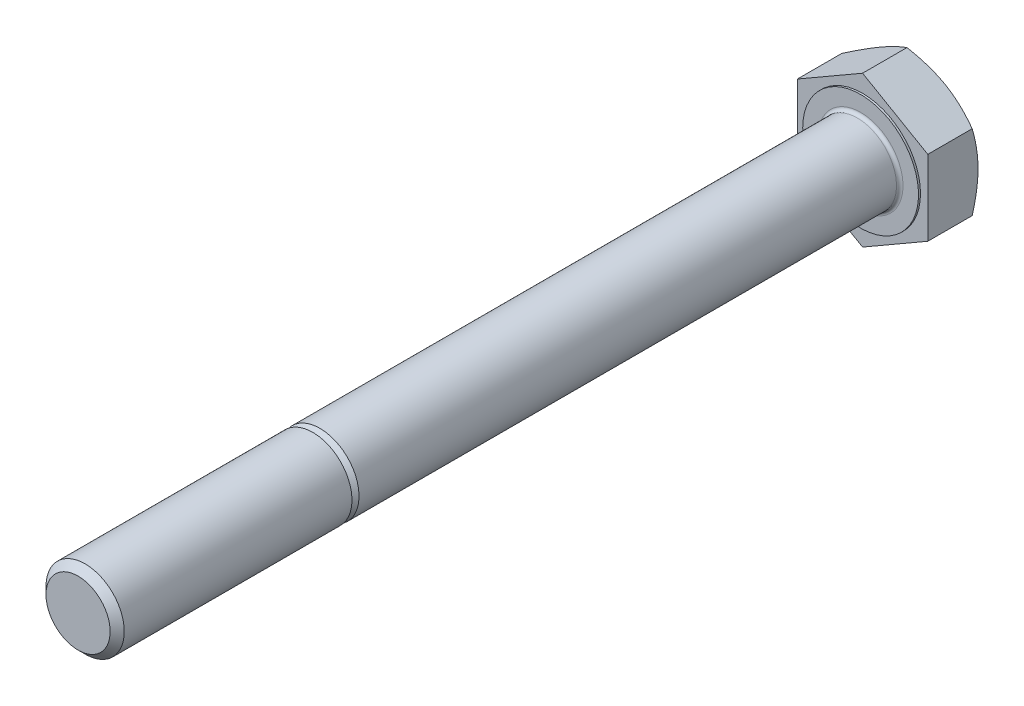
ISO-10303-21;
HEADER;
FILE_DESCRIPTION(('STEP AP214'),'2;1');
FILE_NAME('part.step','',(''),(''),'','','');
FILE_SCHEMA(('AUTOMOTIVE_DESIGN { 1 0 10303 214 1 1 1 1 }'));
ENDSEC;
DATA;
#1=APPLICATION_CONTEXT('core data for automotive mechanical design processes');
#2=APPLICATION_PROTOCOL_DEFINITION('international standard','automotive_design',2000,#1);
#3=PRODUCT_CONTEXT('',#1,'mechanical');
#4=PRODUCT('Part','Part','',(#3));
#5=PRODUCT_RELATED_PRODUCT_CATEGORY('part','',(#4));
#6=PRODUCT_DEFINITION_FORMATION('','',#4);
#7=PRODUCT_DEFINITION_CONTEXT('part definition',#1,'design');
#8=PRODUCT_DEFINITION('design','',#6,#7);
#9=PRODUCT_DEFINITION_SHAPE('','',#8);
#10=(LENGTH_UNIT() NAMED_UNIT(*) SI_UNIT(.MILLI.,.METRE.));
#11=(NAMED_UNIT(*) PLANE_ANGLE_UNIT() SI_UNIT($,.RADIAN.));
#12=(NAMED_UNIT(*) SI_UNIT($,.STERADIAN.) SOLID_ANGLE_UNIT());
#13=UNCERTAINTY_MEASURE_WITH_UNIT(LENGTH_MEASURE(1.E-05),#10,'distance_accuracy_value','');
#14=(GEOMETRIC_REPRESENTATION_CONTEXT(3) GLOBAL_UNCERTAINTY_ASSIGNED_CONTEXT((#13)) GLOBAL_UNIT_ASSIGNED_CONTEXT((#10,
#11,#12)) REPRESENTATION_CONTEXT('',''));
#15=CARTESIAN_POINT('',(0.,0.,0.));
#16=DIRECTION('',(0.,0.,1.));
#17=DIRECTION('',(1.,0.,0.));
#18=AXIS2_PLACEMENT_3D('',#15,#16,#17);
#19=CARTESIAN_POINT('',(0.,0.,60.));
#20=DIRECTION('',(0.,0.,-1.));
#21=DIRECTION('',(-1.,0.,0.));
#22=AXIS2_PLACEMENT_3D('',#19,#20,#21);
#23=PLANE('',#22);
#24=CARTESIAN_POINT('',(0.,0.,60.));
#25=DIRECTION('',(0.,0.,-1.));
#26=DIRECTION('',(-1.,0.,0.));
#27=AXIS2_PLACEMENT_3D('',#24,#25,#26);
#28=CIRCLE('',#27,2.45875);
#29=CARTESIAN_POINT('',(-2.45875,0.,60.));
#30=VERTEX_POINT('',#29);
#31=EDGE_CURVE('E9',#30,#30,#28,.T.);
#32=ORIENTED_EDGE('',*,*,#31,.F.);
#33=EDGE_LOOP('',(#32));
#34=FACE_BOUND('',#33,.T.);
#35=ADVANCED_FACE('F15',(#34),#23,.F.);
#36=CARTESIAN_POINT('',(0.,0.,60.));
#37=DIRECTION('',(0.,0.,-1.));
#38=DIRECTION('',(-1.,0.,0.));
#39=AXIS2_PLACEMENT_3D('',#36,#37,#38);
#40=CONICAL_SURFACE('',#39,2.45875,0.785398163397449);
#41=CARTESIAN_POINT('',(0.,0.,59.45875));
#42=DIRECTION('',(0.,0.,-1.));
#43=DIRECTION('',(-1.,0.,0.));
#44=AXIS2_PLACEMENT_3D('',#41,#42,#43);
#45=CIRCLE('',#44,3.);
#46=CARTESIAN_POINT('',(-3.,0.,59.45875));
#47=VERTEX_POINT('',#46);
#48=EDGE_CURVE('E24',#47,#47,#45,.T.);
#49=ORIENTED_EDGE('',*,*,#48,.F.);
#50=EDGE_LOOP('',(#49));
#51=FACE_BOUND('',#50,.T.);
#52=ORIENTED_EDGE('',*,*,#31,.T.);
#53=EDGE_LOOP('',(#52));
#54=FACE_BOUND('',#53,.T.);
#55=ADVANCED_FACE('F211',(#51,#54),#40,.T.);
#56=CARTESIAN_POINT('',(0.,0.,-0.65));
#57=DIRECTION('',(0.,0.,-1.));
#58=DIRECTION('',(-1.,0.,0.));
#59=AXIS2_PLACEMENT_3D('',#56,#57,#58);
#60=CYLINDRICAL_SURFACE('',#59,3.);
#61=CARTESIAN_POINT('',(0.,0.,42.));
#62=DIRECTION('',(0.,0.,-1.));
#63=DIRECTION('',(-1.,0.,0.));
#64=AXIS2_PLACEMENT_3D('',#61,#62,#63);
#65=CIRCLE('',#64,3.);
#66=CARTESIAN_POINT('',(-3.,0.,42.));
#67=VERTEX_POINT('',#66);
#68=EDGE_CURVE('E226',#67,#67,#65,.T.);
#69=ORIENTED_EDGE('',*,*,#68,.F.);
#70=EDGE_LOOP('',(#69));
#71=FACE_BOUND('',#70,.T.);
#72=ORIENTED_EDGE('',*,*,#48,.T.);
#73=EDGE_LOOP('',(#72));
#74=FACE_BOUND('',#73,.T.);
#75=ADVANCED_FACE('F208',(#71,#74),#60,.T.);
#76=CARTESIAN_POINT('',(0.,3.,42.));
#77=DIRECTION('',(0.,0.,1.));
#78=DIRECTION('',(1.,0.,0.));
#79=AXIS2_PLACEMENT_3D('',#76,#77,#78);
#80=PLANE('',#79);
#81=CARTESIAN_POINT('',(0.,0.,42.));
#82=DIRECTION('',(0.,0.,-1.));
#83=DIRECTION('',(-1.,0.,0.));
#84=AXIS2_PLACEMENT_3D('',#81,#82,#83);
#85=CIRCLE('',#84,2.45875);
#86=CARTESIAN_POINT('',(-2.45875,0.,42.));
#87=VERTEX_POINT('',#86);
#88=EDGE_CURVE('E233',#87,#87,#85,.T.);
#89=ORIENTED_EDGE('',*,*,#88,.F.);
#90=EDGE_LOOP('',(#89));
#91=FACE_BOUND('',#90,.T.);
#92=ORIENTED_EDGE('',*,*,#68,.T.);
#93=EDGE_LOOP('',(#92));
#94=FACE_BOUND('',#93,.T.);
#95=ADVANCED_FACE('F204',(#91,#94),#80,.F.);
#96=CARTESIAN_POINT('',(0.,0.,42.));
#97=DIRECTION('',(0.,0.,-1.));
#98=DIRECTION('',(-1.,0.,0.));
#99=AXIS2_PLACEMENT_3D('',#96,#97,#98);
#100=CONICAL_SURFACE('',#99,2.45875,0.785398163397457);
#101=CARTESIAN_POINT('',(0.,0.,41.45875));
#102=DIRECTION('',(0.,0.,-1.));
#103=DIRECTION('',(-1.,0.,0.));
#104=AXIS2_PLACEMENT_3D('',#101,#102,#103);
#105=CIRCLE('',#104,3.);
#106=CARTESIAN_POINT('',(-3.,0.,41.45875));
#107=VERTEX_POINT('',#106);
#108=EDGE_CURVE('E239',#107,#107,#105,.T.);
#109=ORIENTED_EDGE('',*,*,#108,.F.);
#110=EDGE_LOOP('',(#109));
#111=FACE_BOUND('',#110,.T.);
#112=ORIENTED_EDGE('',*,*,#88,.T.);
#113=EDGE_LOOP('',(#112));
#114=FACE_BOUND('',#113,.T.);
#115=ADVANCED_FACE('F200',(#111,#114),#100,.T.);
#116=CARTESIAN_POINT('',(0.,0.,-0.65));
#117=DIRECTION('',(0.,0.,-1.));
#118=DIRECTION('',(-1.,0.,0.));
#119=AXIS2_PLACEMENT_3D('',#116,#117,#118);
#120=CYLINDRICAL_SURFACE('',#119,3.);
#121=CARTESIAN_POINT('',(0.,0.,0.25));
#122=DIRECTION('',(0.,0.,-1.));
#123=DIRECTION('',(-1.,0.,0.));
#124=AXIS2_PLACEMENT_3D('',#121,#122,#123);
#125=CIRCLE('',#124,3.);
#126=CARTESIAN_POINT('',(-3.,0.,0.25));
#127=VERTEX_POINT('',#126);
#128=EDGE_CURVE('E243',#127,#127,#125,.T.);
#129=ORIENTED_EDGE('',*,*,#128,.F.);
#130=EDGE_LOOP('',(#129));
#131=FACE_BOUND('',#130,.T.);
#132=ORIENTED_EDGE('',*,*,#108,.T.);
#133=EDGE_LOOP('',(#132));
#134=FACE_BOUND('',#133,.T.);
#135=ADVANCED_FACE('F196',(#131,#134),#120,.T.);
#136=CARTESIAN_POINT('',(0.,0.,0.25));
#137=DIRECTION('',(0.,0.,-1.));
#138=DIRECTION('',(-1.,0.,0.));
#139=AXIS2_PLACEMENT_3D('',#136,#137,#138);
#140=TOROIDAL_SURFACE('',#139,3.25,0.25);
#141=ORIENTED_EDGE('',*,*,#128,.T.);
#142=EDGE_LOOP('',(#141));
#143=FACE_BOUND('',#142,.T.);
#144=CARTESIAN_POINT('',(0.,0.,0.));
#145=DIRECTION('',(0.,0.,-1.));
#146=DIRECTION('',(-1.,0.,0.));
#147=AXIS2_PLACEMENT_3D('',#144,#145,#146);
#148=CIRCLE('',#147,3.25);
#149=CARTESIAN_POINT('',(-3.25,0.,0.));
#150=VERTEX_POINT('',#149);
#151=EDGE_CURVE('E247',#150,#150,#148,.T.);
#152=ORIENTED_EDGE('',*,*,#151,.F.);
#153=EDGE_LOOP('',(#152));
#154=FACE_BOUND('',#153,.T.);
#155=ADVANCED_FACE('F192',(#143,#154),#140,.F.);
#156=CARTESIAN_POINT('',(0.,3.25,0.));
#157=DIRECTION('',(0.,0.,-1.));
#158=DIRECTION('',(-1.,0.,0.));
#159=AXIS2_PLACEMENT_3D('',#156,#157,#158);
#160=PLANE('',#159);
#161=CARTESIAN_POINT('',(0.,0.,0.));
#162=DIRECTION('',(0.,0.,-1.));
#163=DIRECTION('',(-1.,0.,0.));
#164=AXIS2_PLACEMENT_3D('',#161,#162,#163);
#165=CIRCLE('',#164,4.44);
#166=CARTESIAN_POINT('',(-4.44,0.,0.));
#167=VERTEX_POINT('',#166);
#168=EDGE_CURVE('E250',#167,#167,#165,.T.);
#169=ORIENTED_EDGE('',*,*,#168,.F.);
#170=EDGE_LOOP('',(#169));
#171=FACE_BOUND('',#170,.T.);
#172=ORIENTED_EDGE('',*,*,#151,.T.);
#173=EDGE_LOOP('',(#172));
#174=FACE_BOUND('',#173,.T.);
#175=ADVANCED_FACE('F188',(#171,#174),#160,.F.);
#176=CARTESIAN_POINT('',(0.,0.,-0.65));
#177=DIRECTION('',(0.,0.,-1.));
#178=DIRECTION('',(-1.,0.,0.));
#179=AXIS2_PLACEMENT_3D('',#176,#177,#178);
#180=CYLINDRICAL_SURFACE('',#179,4.44);
#181=CARTESIAN_POINT('',(0.,0.,-0.15));
#182=DIRECTION('',(0.,0.,1.));
#183=DIRECTION('',(1.,0.,0.));
#184=AXIS2_PLACEMENT_3D('',#181,#182,#183);
#185=CIRCLE('',#184,4.44);
#186=CARTESIAN_POINT('',(4.44,0.,-0.15));
#187=VERTEX_POINT('',#186);
#188=EDGE_CURVE('E18',#187,#187,#185,.T.);
#189=ORIENTED_EDGE('',*,*,#188,.T.);
#190=EDGE_LOOP('',(#189));
#191=FACE_BOUND('',#190,.T.);
#192=ORIENTED_EDGE('',*,*,#168,.T.);
#193=EDGE_LOOP('',(#192));
#194=FACE_BOUND('',#193,.T.);
#195=ADVANCED_FACE('F185',(#191,#194),#180,.T.);
#196=CARTESIAN_POINT('',(0.,0.,-0.15));
#197=DIRECTION('',(0.,0.,1.));
#198=DIRECTION('',(-1.,0.,0.));
#199=AXIS2_PLACEMENT_3D('',#196,#197,#198);
#200=PLANE('',#199);
#201=DIRECTION('',(0.866025403784439,-0.5,0.));
#202=VECTOR('',#201,1.);
#203=CARTESIAN_POINT('',(0.,-5.77350269189626,-0.15));
#204=LINE('',#203,#202);
#205=CARTESIAN_POINT('',(-5.,-2.88675134594813,-0.15));
#206=VERTEX_POINT('',#205);
#207=CARTESIAN_POINT('',(0.,-5.77350269189626,-0.15));
#208=VERTEX_POINT('',#207);
#209=EDGE_CURVE('E274',#206,#208,#204,.T.);
#210=ORIENTED_EDGE('',*,*,#209,.T.);
#211=DIRECTION('',(0.866025403784439,0.5,0.));
#212=VECTOR('',#211,1.);
#213=CARTESIAN_POINT('',(5.,-2.88675134594812,-0.15));
#214=LINE('',#213,#212);
#215=CARTESIAN_POINT('',(5.,-2.88675134594812,-0.15));
#216=VERTEX_POINT('',#215);
#217=EDGE_CURVE('E99',#208,#216,#214,.T.);
#218=ORIENTED_EDGE('',*,*,#217,.T.);
#219=DIRECTION('',(0.,1.,0.));
#220=VECTOR('',#219,1.);
#221=CARTESIAN_POINT('',(5.,2.88675134594813,-0.15));
#222=LINE('',#221,#220);
#223=CARTESIAN_POINT('',(5.,2.88675134594813,-0.15));
#224=VERTEX_POINT('',#223);
#225=EDGE_CURVE('E95',#216,#224,#222,.T.);
#226=ORIENTED_EDGE('',*,*,#225,.T.);
#227=DIRECTION('',(-0.866025403784439,0.5,0.));
#228=VECTOR('',#227,1.);
#229=CARTESIAN_POINT('',(0.,5.77350269189626,-0.15));
#230=LINE('',#229,#228);
#231=CARTESIAN_POINT('',(0.,5.77350269189626,-0.15));
#232=VERTEX_POINT('',#231);
#233=EDGE_CURVE('E107',#224,#232,#230,.T.);
#234=ORIENTED_EDGE('',*,*,#233,.T.);
#235=DIRECTION('',(-0.866025403784439,-0.5,0.));
#236=VECTOR('',#235,1.);
#237=CARTESIAN_POINT('',(-5.,2.88675134594813,-0.15));
#238=LINE('',#237,#236);
#239=CARTESIAN_POINT('',(-5.,2.88675134594813,-0.15));
#240=VERTEX_POINT('',#239);
#241=EDGE_CURVE('E299',#232,#240,#238,.T.);
#242=ORIENTED_EDGE('',*,*,#241,.T.);
#243=DIRECTION('',(0.,-1.,0.));
#244=VECTOR('',#243,1.);
#245=CARTESIAN_POINT('',(-5.,-2.88675134594813,-0.15));
#246=LINE('',#245,#244);
#247=EDGE_CURVE('E278',#240,#206,#246,.T.);
#248=ORIENTED_EDGE('',*,*,#247,.T.);
#249=EDGE_LOOP('',(#210,#218,#226,#234,#242,#248));
#250=FACE_BOUND('',#249,.T.);
#251=ORIENTED_EDGE('',*,*,#188,.F.);
#252=EDGE_LOOP('',(#251));
#253=FACE_BOUND('',#252,.T.);
#254=ADVANCED_FACE('F140',(#250,#253),#200,.T.);
#255=CARTESIAN_POINT('',(0.,0.,-3.55255354137804));
#256=DIRECTION('',(0.,0.,1.));
#257=DIRECTION('',(-1.,0.,0.));
#258=AXIS2_PLACEMENT_3D('',#255,#256,#257);
#259=CONICAL_SURFACE('',#258,5.775,1.0471975511966);
#260=CARTESIAN_POINT('',(0.,0.,-4.));
#261=DIRECTION('',(0.,0.,1.));
#262=DIRECTION('',(-1.,0.,0.));
#263=AXIS2_PLACEMENT_3D('',#260,#261,#262);
#264=CIRCLE('',#263,5.);
#265=CARTESIAN_POINT('',(-2.5,-4.3301270189222,-4.));
#266=VERTEX_POINT('',#265);
#267=CARTESIAN_POINT('',(2.5,-4.33012701892219,-4.));
#268=VERTEX_POINT('',#267);
#269=EDGE_CURVE('E320',#266,#268,#264,.T.);
#270=ORIENTED_EDGE('',*,*,#269,.T.);
#271=CARTESIAN_POINT('',(5.000002,-2.88675019124759,-3.55341734594793));
#272=CARTESIAN_POINT('',(4.78027074694607,-3.01361208934764,-3.62667401283849));
#273=CARTESIAN_POINT('',(4.5586601198803,-3.14155904453935,-3.69330350087609));
#274=CARTESIAN_POINT('',(4.11160176522467,-3.39966830594325,-3.80960388176341));
#275=CARTESIAN_POINT('',(3.88614609670003,-3.52983519685628,-3.859233638035));
#276=CARTESIAN_POINT('',(3.43799439633442,-3.78857570170015,-3.93647343389728));
#277=CARTESIAN_POINT('',(3.21536814331772,-3.91710902880802,-3.96459799992946));
#278=CARTESIAN_POINT('',(2.8806459561398,-4.11036097367893,-3.98981464288414));
#279=CARTESIAN_POINT('',(2.76899557601673,-4.17482235069811,-3.99539321968897));
#280=CARTESIAN_POINT('',(2.54559174139457,-4.30380461475521,-4.00079886451652));
#281=CARTESIAN_POINT('',(2.43383829018766,-4.36832549989239,-4.00062611028573));
#282=CARTESIAN_POINT('',(2.12769088590962,-4.54507978616402,-3.99223835401767));
#283=CARTESIAN_POINT('',(1.93339845483021,-4.65725457354923,-3.97816111429647));
#284=CARTESIAN_POINT('',(1.54610304420474,-4.88085968312974,-3.93352860367383));
#285=CARTESIAN_POINT('',(1.35310142524446,-4.9922892197905,-3.90295808665975));
#286=CARTESIAN_POINT('',(0.965026180739004,-5.21634456667155,-3.826542206783));
#287=CARTESIAN_POINT('',(0.770001514907567,-5.32894210998795,-3.78037315312653));
#288=CARTESIAN_POINT('',(0.382860131316657,-5.55245829201861,-3.67558875648398));
#289=CARTESIAN_POINT('',(0.190738457644298,-5.66337979203051,-3.61699801824105));
#290=CARTESIAN_POINT('',(-1.9999999993508E-06,-5.7735038465968,-3.55341734594793));
#291=B_SPLINE_CURVE_WITH_KNOTS('',3,(#271,#272,#273,#274,#275,#276,#277,#278,#279,#280,#281,
#282,#283,#284,#285,#286,#287,#288,#289,#290),.UNSPECIFIED.,.F.,.F.,(4,2,2,2,2,2,2,2,2,4),(0.,
0.792540187012439,1.58698486313849,2.36176947896395,2.74878786986339,3.13579429986343,
3.80946255620209,4.48375460996337,5.17299926182492,5.86089121185928),.UNSPECIFIED.);
#292=CARTESIAN_POINT('',(0.,-5.77350269189626,-3.5534180126148));
#293=VERTEX_POINT('',#292);
#294=EDGE_CURVE('E31',#268,#293,#291,.T.);
#295=ORIENTED_EDGE('',*,*,#294,.T.);
#296=CARTESIAN_POINT('',(2.00000000064743E-06,-5.7735038465968,-3.55341734594793));
#297=CARTESIAN_POINT('',(-0.219729253053924,-5.64664194849674,-3.62667401283849));
#298=CARTESIAN_POINT('',(-0.441339880119702,-5.51869499330503,-3.69330350087609));
#299=CARTESIAN_POINT('',(-0.888398234775334,-5.26058573190113,-3.80960388176341));
#300=CARTESIAN_POINT('',(-1.11385390329997,-5.13041884098811,-3.85923363803499));
#301=CARTESIAN_POINT('',(-1.56200560366558,-4.87167833614423,-3.93647343389728));
#302=CARTESIAN_POINT('',(-1.78463185668228,-4.74314500903636,-3.96459799992946));
#303=CARTESIAN_POINT('',(-2.1193540438602,-4.54989306416545,-3.98981464288413));
#304=CARTESIAN_POINT('',(-2.23100442398327,-4.48543168714627,-3.99539321968897));
#305=CARTESIAN_POINT('',(-2.45440825860543,-4.35644942308917,-4.00079886451652));
#306=CARTESIAN_POINT('',(-2.56616170981234,-4.291928537952,-4.00062611028572));
#307=CARTESIAN_POINT('',(-2.87230911409038,-4.11517425168036,-3.99223835401768));
#308=CARTESIAN_POINT('',(-3.06660154516979,-4.00299946429516,-3.97816111429647));
#309=CARTESIAN_POINT('',(-3.45389695579525,-3.77939435471464,-3.93352860367382));
#310=CARTESIAN_POINT('',(-3.64689857475554,-3.66796481805389,-3.90295808665975));
#311=CARTESIAN_POINT('',(-4.03497381926099,-3.44390947117283,-3.826542206783));
#312=CARTESIAN_POINT('',(-4.22999848509243,-3.33131192785644,-3.78037315312652));
#313=CARTESIAN_POINT('',(-4.61713986868334,-3.10779574582578,-3.67558875648398));
#314=CARTESIAN_POINT('',(-4.8092615423557,-2.99687424581388,-3.61699801824105));
#315=CARTESIAN_POINT('',(-5.000002,-2.88675019124759,-3.55341734594793));
#316=B_SPLINE_CURVE_WITH_KNOTS('',3,(#296,#297,#298,#299,#300,#301,#302,#303,#304,#305,#306,
#307,#308,#309,#310,#311,#312,#313,#314,#315),.UNSPECIFIED.,.F.,.F.,(4,2,2,2,2,2,2,2,2,4),(0.,
0.792540187012439,1.58698486313849,2.36176947896395,2.74878786986339,3.13579429986343,
3.80946255620209,4.48375460996337,5.17299926182492,5.86089121185927),.UNSPECIFIED.);
#317=EDGE_CURVE('E170',#293,#266,#316,.T.);
#318=ORIENTED_EDGE('',*,*,#317,.T.);
#319=EDGE_LOOP('',(#270,#295,#318));
#320=FACE_BOUND('',#319,.T.);
#321=ADVANCED_FACE('F138',(#320),#259,.T.);
#322=CARTESIAN_POINT('',(5.,0.,-4.));
#323=VERTEX_POINT('',#322);
#324=CARTESIAN_POINT('',(2.5,4.3301270189222,-4.));
#325=VERTEX_POINT('',#324);
#326=EDGE_CURVE('E337',#323,#325,#264,.T.);
#327=ORIENTED_EDGE('',*,*,#326,.T.);
#328=CARTESIAN_POINT('',(-2.00000000176389E-06,5.7735038465968,-3.55341734594793));
#329=CARTESIAN_POINT('',(0.219729253053923,5.64664194849674,-3.62667401283849));
#330=CARTESIAN_POINT('',(0.441339880119701,5.51869499330503,-3.69330350087608));
#331=CARTESIAN_POINT('',(0.888398234775333,5.26058573190113,-3.80960388176341));
#332=CARTESIAN_POINT('',(1.11385390329997,5.13041884098811,-3.85923363803499));
#333=CARTESIAN_POINT('',(1.56200560366558,4.87167833614423,-3.93647343389727));
#334=CARTESIAN_POINT('',(1.78463185668228,4.74314500903636,-3.96459799992946));
#335=CARTESIAN_POINT('',(2.1193540438602,4.54989306416545,-3.98981464288413));
#336=CARTESIAN_POINT('',(2.23100442398327,4.48543168714627,-3.99539321968896));
#337=CARTESIAN_POINT('',(2.45440825860543,4.35644942308917,-4.00079886451652));
#338=CARTESIAN_POINT('',(2.56616170981234,4.291928537952,-4.00062611028572));
#339=CARTESIAN_POINT('',(2.87230911409038,4.11517425168036,-3.99223835401768));
#340=CARTESIAN_POINT('',(3.06660154516979,4.00299946429516,-3.97816111429647));
#341=CARTESIAN_POINT('',(3.45389695579525,3.77939435471464,-3.93352860367382));
#342=CARTESIAN_POINT('',(3.64689857475554,3.66796481805389,-3.90295808665975));
#343=CARTESIAN_POINT('',(4.03497381926099,3.44390947117283,-3.826542206783));
#344=CARTESIAN_POINT('',(4.22999848509243,3.33131192785644,-3.78037315312652));
#345=CARTESIAN_POINT('',(4.61713986868334,3.10779574582578,-3.67558875648398));
#346=CARTESIAN_POINT('',(4.8092615423557,2.99687424581388,-3.61699801824105));
#347=CARTESIAN_POINT('',(5.000002,2.88675019124759,-3.55341734594793));
#348=B_SPLINE_CURVE_WITH_KNOTS('',3,(#328,#329,#330,#331,#332,#333,#334,#335,#336,#337,#338,
#339,#340,#341,#342,#343,#344,#345,#346,#347),.UNSPECIFIED.,.F.,.F.,(4,2,2,2,2,2,2,2,2,4),(0.,
0.792540187012439,1.58698486313849,2.36176947896395,2.74878786986339,3.13579429986343,
3.80946255620209,4.48375460996337,5.17299926182492,5.86089121185927),.UNSPECIFIED.);
#349=CARTESIAN_POINT('',(5.,2.88675134594813,-3.5534180126148));
#350=VERTEX_POINT('',#349);
#351=EDGE_CURVE('E146',#325,#350,#348,.T.);
#352=ORIENTED_EDGE('',*,*,#351,.T.);
#353=CARTESIAN_POINT('',(5.,7.6562098916072,-1.60730851220314));
#354=CARTESIAN_POINT('',(5.,7.43668068445188,-1.71339764971142));
#355=CARTESIAN_POINT('',(5.,7.21663244981121,-1.81843220971194));
#356=CARTESIAN_POINT('',(5.,6.77521729214901,-2.02578955660455));
#357=CARTESIAN_POINT('',(5.,6.55385014884433,-2.12811187401152));
#358=CARTESIAN_POINT('',(5.,6.10832079221155,-2.32998113103873));
#359=CARTESIAN_POINT('',(5.,5.8841498332562,-2.42950883856025));
#360=CARTESIAN_POINT('',(5.,5.43396545890423,-2.62428946678928));
#361=CARTESIAN_POINT('',(5.,5.20795214026935,-2.71954261031161));
#362=CARTESIAN_POINT('',(5.,4.75091730358844,-2.90576853562678));
#363=CARTESIAN_POINT('',(5.,4.51986836696229,-2.99667439468201));
#364=CARTESIAN_POINT('',(5.,4.05504511794166,-3.17136663535019));
#365=CARTESIAN_POINT('',(5.,3.82127050561655,-3.25515222488515));
#366=CARTESIAN_POINT('',(5.,3.3511049214154,-3.41335295122633));
#367=CARTESIAN_POINT('',(5.,3.1147207202618,-3.48778800852407));
#368=CARTESIAN_POINT('',(5.,2.63858935414024,-3.62486947210752));
#369=CARTESIAN_POINT('',(5.,2.39884327849118,-3.6875196062624));
#370=CARTESIAN_POINT('',(5.,1.91583600979795,-3.79799301517174));
#371=CARTESIAN_POINT('',(5.,1.67257390027251,-3.845812348464));
#372=CARTESIAN_POINT('',(5.,1.18308256945893,-3.92339260894802));
#373=CARTESIAN_POINT('',(5.,0.936853345569402,-3.95315352030607));
#374=CARTESIAN_POINT('',(5.,0.567117593289452,-3.98234325133118));
#375=CARTESIAN_POINT('',(5.,0.444189898759256,-3.98949936634909));
#376=CARTESIAN_POINT('',(5.,0.198136128994923,-3.99860265589306));
#377=CARTESIAN_POINT('',(5.,0.0750100563582902,-4.00054989807679));
#378=CARTESIAN_POINT('',(5.,-0.171177216207564,-3.99918313774808));
#379=CARTESIAN_POINT('',(5.,-0.294238424644018,-3.99587061329656));
#380=CARTESIAN_POINT('',(5.,-0.540114422491308,-3.98406827403109));
#381=CARTESIAN_POINT('',(5.,-0.662929199152966,-3.97557819794883));
#382=CARTESIAN_POINT('',(5.,-0.960602635172513,-3.94890221291608));
#383=CARTESIAN_POINT('',(5.,-1.13523252606317,-3.92812146624754));
#384=CARTESIAN_POINT('',(5.,-1.48312982453558,-3.87724859224778));
#385=CARTESIAN_POINT('',(5.,-1.65639704728773,-3.84715522336811));
#386=CARTESIAN_POINT('',(5.,-2.0014599099285,-3.77872143768562));
#387=CARTESIAN_POINT('',(5.,-2.17325390132186,-3.74037278751756));
#388=CARTESIAN_POINT('',(5.,-2.51508012917844,-3.65659803659306));
#389=CARTESIAN_POINT('',(5.,-2.68511247222647,-3.61117236671524));
#390=CARTESIAN_POINT('',(5.,-3.02759472997325,-3.51314465542335));
#391=CARTESIAN_POINT('',(5.,-3.20000183568428,-3.46039407843568));
#392=CARTESIAN_POINT('',(5.,-3.54299370259063,-3.34968060702553));
#393=CARTESIAN_POINT('',(5.,-3.71357963115188,-3.29172130765132));
#394=CARTESIAN_POINT('',(5.,-4.0522446464634,-3.17178761900049));
#395=CARTESIAN_POINT('',(5.00000000000001,-4.22033243885282,-3.10983766516145));
#396=CARTESIAN_POINT('',(5.00000000000001,-4.55520387372808,-2.98230148307792));
#397=CARTESIAN_POINT('',(5.,-4.72198695763952,-2.91671378527652));
#398=CARTESIAN_POINT('',(5.,-4.88816412582649,-2.84966706307693));
#399=B_SPLINE_CURVE_WITH_KNOTS('',3,(#353,#354,#355,#356,#357,#358,#359,#360,#361,#362,#363,
#364,#365,#366,#367,#368,#369,#370,#371,#372,#373,#374,#375,#376,#377,#378,#379,#380,#381,#382,
#383,#384,#385,#386,#387,#388,#389,#390,#391,#392,#393,#394,#395,#396,#397,#398),.UNSPECIFIED.,
.F.,.F.,(4,2,2,2,2,2,2,2,2,2,2,2,2,2,2,2,2,2,2,2,2,2,4),(0.,0.731468501053904,1.46306280212576,
2.19884351250473,2.93458582511369,3.67936259473395,4.42422210717282,5.16746683356836,
5.91047605604179,6.65368257320434,7.39688974201329,7.76620341787991,8.13551229673491,
8.5047174134909,8.87394116252395,9.40123334160666,9.92859584900567,10.456486776027,
10.9843455753877,11.5251349139371,12.0655538262241,12.6029309498223,13.1405267642076),.UNSPECIFIED.);
#400=EDGE_CURVE('E112',#350,#323,#399,.T.);
#401=ORIENTED_EDGE('',*,*,#400,.T.);
#402=EDGE_LOOP('',(#327,#352,#401));
#403=FACE_BOUND('',#402,.T.);
#404=ADVANCED_FACE('F139',(#403),#259,.T.);
#405=CARTESIAN_POINT('',(-2.5,4.3301270189222,-4.));
#406=VERTEX_POINT('',#405);
#407=EDGE_CURVE('E341',#325,#406,#264,.T.);
#408=ORIENTED_EDGE('',*,*,#407,.T.);
#409=CARTESIAN_POINT('',(-5.000002,2.88675019124759,-3.55341734594793));
#410=CARTESIAN_POINT('',(-4.78027074694607,3.01361208934765,-3.62667401283849));
#411=CARTESIAN_POINT('',(-4.5586601198803,3.14155904453936,-3.69330350087609));
#412=CARTESIAN_POINT('',(-4.11160176522467,3.39966830594326,-3.80960388176341));
#413=CARTESIAN_POINT('',(-3.88614609670003,3.52983519685628,-3.859233638035));
#414=CARTESIAN_POINT('',(-3.43799439633442,3.78857570170016,-3.93647343389728));
#415=CARTESIAN_POINT('',(-3.21536814331772,3.91710902880803,-3.96459799992946));
#416=CARTESIAN_POINT('',(-2.8806459561398,4.11036097367894,-3.98981464288413));
#417=CARTESIAN_POINT('',(-2.76899557601673,4.17482235069812,-3.99539321968897));
#418=CARTESIAN_POINT('',(-2.54559174139457,4.30380461475522,-4.00079886451652));
#419=CARTESIAN_POINT('',(-2.43383829018766,4.36832549989239,-4.00062611028572));
#420=CARTESIAN_POINT('',(-2.12769088590962,4.54507978616403,-3.99223835401768));
#421=CARTESIAN_POINT('',(-1.93339845483021,4.65725457354923,-3.97816111429647));
#422=CARTESIAN_POINT('',(-1.54610304420475,4.88085968312975,-3.93352860367382));
#423=CARTESIAN_POINT('',(-1.35310142524446,4.9922892197905,-3.90295808665975));
#424=CARTESIAN_POINT('',(-0.965026180739006,5.21634456667156,-3.826542206783));
#425=CARTESIAN_POINT('',(-0.77000151490757,5.32894210998795,-3.78037315312652));
#426=CARTESIAN_POINT('',(-0.38286013131666,5.55245829201861,-3.67558875648398));
#427=CARTESIAN_POINT('',(-0.190738457644301,5.66337979203051,-3.61699801824105));
#428=CARTESIAN_POINT('',(1.99999999749083E-06,5.7735038465968,-3.55341734594793));
#429=B_SPLINE_CURVE_WITH_KNOTS('',3,(#409,#410,#411,#412,#413,#414,#415,#416,#417,#418,#419,
#420,#421,#422,#423,#424,#425,#426,#427,#428),.UNSPECIFIED.,.F.,.F.,(4,2,2,2,2,2,2,2,2,4),(0.,
0.792540187012439,1.58698486313849,2.36176947896395,2.74878786986339,3.13579429986343,
3.80946255620209,4.48375460996337,5.17299926182492,5.86089121185927),.UNSPECIFIED.);
#430=CARTESIAN_POINT('',(0.,5.77350269189626,-3.5534180126148));
#431=VERTEX_POINT('',#430);
#432=EDGE_CURVE('E153',#406,#431,#429,.T.);
#433=ORIENTED_EDGE('',*,*,#432,.T.);
#434=EDGE_CURVE('E344',#431,#325,#348,.T.);
#435=ORIENTED_EDGE('',*,*,#434,.T.);
#436=EDGE_LOOP('',(#408,#433,#435));
#437=FACE_BOUND('',#436,.T.);
#438=ADVANCED_FACE('F332',(#437),#259,.T.);
#439=CARTESIAN_POINT('',(-5.,0.,-4.));
#440=VERTEX_POINT('',#439);
#441=EDGE_CURVE('E358',#406,#440,#264,.T.);
#442=ORIENTED_EDGE('',*,*,#441,.T.);
#443=CARTESIAN_POINT('',(-5.,7.65620989160719,-1.60730851220314));
#444=CARTESIAN_POINT('',(-5.,7.43668068445187,-1.71339764971142));
#445=CARTESIAN_POINT('',(-5.00000000000001,7.2166324498112,-1.81843220971194));
#446=CARTESIAN_POINT('',(-5.00000000000001,6.775217292149,-2.02578955660455));
#447=CARTESIAN_POINT('',(-5.,6.55385014884432,-2.12811187401153));
#448=CARTESIAN_POINT('',(-5.,6.10832079221154,-2.32998113103873));
#449=CARTESIAN_POINT('',(-5.,5.88414983325619,-2.42950883856025));
#450=CARTESIAN_POINT('',(-5.,5.43396545890422,-2.62428946678928));
#451=CARTESIAN_POINT('',(-5.,5.20795214026934,-2.71954261031161));
#452=CARTESIAN_POINT('',(-5.,4.75091730358843,-2.90576853562678));
#453=CARTESIAN_POINT('',(-5.,4.51986836696229,-2.99667439468201));
#454=CARTESIAN_POINT('',(-5.,4.05504511794165,-3.17136663535019));
#455=CARTESIAN_POINT('',(-5.,3.82127050561654,-3.25515222488515));
#456=CARTESIAN_POINT('',(-5.,3.3511049214154,-3.41335295122633));
#457=CARTESIAN_POINT('',(-5.,3.1147207202618,-3.48778800852407));
#458=CARTESIAN_POINT('',(-5.,2.63858935414024,-3.62486947210752));
#459=CARTESIAN_POINT('',(-5.,2.39884327849118,-3.6875196062624));
#460=CARTESIAN_POINT('',(-5.,1.91583600979795,-3.79799301517174));
#461=CARTESIAN_POINT('',(-5.,1.67257390027251,-3.845812348464));
#462=CARTESIAN_POINT('',(-5.,1.18308256945893,-3.92339260894802));
#463=CARTESIAN_POINT('',(-5.,0.936853345569401,-3.95315352030607));
#464=CARTESIAN_POINT('',(-5.,0.567117593289451,-3.98234325133118));
#465=CARTESIAN_POINT('',(-5.,0.444189898759255,-3.98949936634909));
#466=CARTESIAN_POINT('',(-5.,0.198136128994921,-3.99860265589306));
#467=CARTESIAN_POINT('',(-5.,0.0750100563582885,-4.00054989807679));
#468=CARTESIAN_POINT('',(-5.,-0.171177216207566,-3.99918313774808));
#469=CARTESIAN_POINT('',(-5.,-0.29423842464402,-3.99587061329656));
#470=CARTESIAN_POINT('',(-5.,-0.540114422491311,-3.98406827403109));
#471=CARTESIAN_POINT('',(-5.,-0.662929199152969,-3.97557819794883));
#472=CARTESIAN_POINT('',(-5.,-0.960602635172517,-3.94890221291608));
#473=CARTESIAN_POINT('',(-5.,-1.13523252606317,-3.92812146624754));
#474=CARTESIAN_POINT('',(-5.,-1.48312982453558,-3.87724859224778));
#475=CARTESIAN_POINT('',(-5.,-1.65639704728773,-3.84715522336811));
#476=CARTESIAN_POINT('',(-5.,-2.0014599099285,-3.77872143768563));
#477=CARTESIAN_POINT('',(-5.,-2.17325390132186,-3.74037278751756));
#478=CARTESIAN_POINT('',(-5.,-2.51508012917844,-3.65659803659306));
#479=CARTESIAN_POINT('',(-5.,-2.68511247222647,-3.61117236671524));
#480=CARTESIAN_POINT('',(-5.,-3.02759472997325,-3.51314465542335));
#481=CARTESIAN_POINT('',(-5.,-3.20000183568428,-3.46039407843568));
#482=CARTESIAN_POINT('',(-5.,-3.54299370259063,-3.34968060702553));
#483=CARTESIAN_POINT('',(-5.,-3.71357963115188,-3.29172130765132));
#484=CARTESIAN_POINT('',(-5.,-4.0522446464634,-3.17178761900049));
#485=CARTESIAN_POINT('',(-5.,-4.22033243885282,-3.10983766516145));
#486=CARTESIAN_POINT('',(-5.,-4.55520387372808,-2.98230148307792));
#487=CARTESIAN_POINT('',(-5.,-4.72198695763952,-2.91671378527652));
#488=CARTESIAN_POINT('',(-5.,-4.88816412582649,-2.84966706307693));
#489=B_SPLINE_CURVE_WITH_KNOTS('',3,(#443,#444,#445,#446,#447,#448,#449,#450,#451,#452,#453,
#454,#455,#456,#457,#458,#459,#460,#461,#462,#463,#464,#465,#466,#467,#468,#469,#470,#471,#472,
#473,#474,#475,#476,#477,#478,#479,#480,#481,#482,#483,#484,#485,#486,#487,#488),.UNSPECIFIED.,
.F.,.F.,(4,2,2,2,2,2,2,2,2,2,2,2,2,2,2,2,2,2,2,2,2,2,4),(0.,0.731468501053905,1.46306280212576,
2.19884351250473,2.93458582511369,3.67936259473395,4.42422210717281,5.16746683356835,
5.91047605604178,6.65368257320433,7.39688974201328,7.7662034178799,8.1355122967349,
8.50471741349089,8.87394116252394,9.40123334160666,9.92859584900567,10.456486776027,
10.9843455753877,11.5251349139371,12.0655538262241,12.6029309498223,13.1405267642076),.UNSPECIFIED.);
#490=CARTESIAN_POINT('',(-5.,2.88675134594813,-3.5534180126148));
#491=VERTEX_POINT('',#490);
#492=EDGE_CURVE('E159',#440,#491,#489,.F.);
#493=ORIENTED_EDGE('',*,*,#492,.T.);
#494=EDGE_CURVE('E362',#491,#406,#429,.T.);
#495=ORIENTED_EDGE('',*,*,#494,.T.);
#496=EDGE_LOOP('',(#442,#493,#495));
#497=FACE_BOUND('',#496,.T.);
#498=ADVANCED_FACE('F350',(#497),#259,.T.);
#499=EDGE_CURVE('E324',#440,#266,#264,.T.);
#500=ORIENTED_EDGE('',*,*,#499,.T.);
#501=CARTESIAN_POINT('',(-5.,-2.88675134594813,-3.5534180126148));
#502=VERTEX_POINT('',#501);
#503=EDGE_CURVE('E39',#266,#502,#316,.T.);
#504=ORIENTED_EDGE('',*,*,#503,.T.);
#505=EDGE_CURVE('E171',#502,#440,#489,.F.);
#506=ORIENTED_EDGE('',*,*,#505,.T.);
#507=EDGE_LOOP('',(#500,#504,#506));
#508=FACE_BOUND('',#507,.T.);
#509=ADVANCED_FACE('F314',(#508),#259,.T.);
#510=CARTESIAN_POINT('',(0.,-5.,-4.));
#511=DIRECTION('',(0.,0.,-1.));
#512=DIRECTION('',(1.,0.,0.));
#513=AXIS2_PLACEMENT_3D('',#510,#511,#512);
#514=PLANE('',#513);
#515=ORIENTED_EDGE('',*,*,#499,.F.);
#516=ORIENTED_EDGE('',*,*,#441,.F.);
#517=ORIENTED_EDGE('',*,*,#407,.F.);
#518=ORIENTED_EDGE('',*,*,#326,.F.);
#519=EDGE_CURVE('E110',#268,#323,#264,.T.);
#520=ORIENTED_EDGE('',*,*,#519,.F.);
#521=ORIENTED_EDGE('',*,*,#269,.F.);
#522=EDGE_LOOP('',(#515,#516,#517,#518,#520,#521));
#523=FACE_BOUND('',#522,.T.);
#524=ADVANCED_FACE('F137',(#523),#514,.T.);
#525=CARTESIAN_POINT('',(5.,-2.88675134594812,-3.5534180126148));
#526=VERTEX_POINT('',#525);
#527=EDGE_CURVE('E92',#323,#526,#399,.T.);
#528=ORIENTED_EDGE('',*,*,#527,.T.);
#529=EDGE_CURVE('E101',#526,#268,#291,.T.);
#530=ORIENTED_EDGE('',*,*,#529,.T.);
#531=ORIENTED_EDGE('',*,*,#519,.T.);
#532=EDGE_LOOP('',(#528,#530,#531));
#533=FACE_BOUND('',#532,.T.);
#534=ADVANCED_FACE('F109',(#533),#259,.T.);
#535=CARTESIAN_POINT('',(5.,-2.88675134594812,-5.));
#536=DIRECTION('',(-0.5,0.866025403784439,0.));
#537=DIRECTION('',(0.866025403784439,0.5,0.));
#538=AXIS2_PLACEMENT_3D('',#535,#536,#537);
#539=PLANE('',#538);
#540=ORIENTED_EDGE('',*,*,#217,.F.);
#541=DIRECTION('',(0.,0.,1.));
#542=VECTOR('',#541,1.);
#543=CARTESIAN_POINT('',(0.,-5.77350269189626,-5.));
#544=LINE('',#543,#542);
#545=EDGE_CURVE('E113',#293,#208,#544,.T.);
#546=ORIENTED_EDGE('',*,*,#545,.F.);
#547=ORIENTED_EDGE('',*,*,#294,.F.);
#548=ORIENTED_EDGE('',*,*,#529,.F.);
#549=DIRECTION('',(0.,0.,1.));
#550=VECTOR('',#549,1.);
#551=CARTESIAN_POINT('',(5.,-2.88675134594812,-5.));
#552=LINE('',#551,#550);
#553=EDGE_CURVE('E89',#526,#216,#552,.T.);
#554=ORIENTED_EDGE('',*,*,#553,.T.);
#555=EDGE_LOOP('',(#540,#546,#547,#548,#554));
#556=FACE_BOUND('',#555,.T.);
#557=ADVANCED_FACE('F102',(#556),#539,.F.);
#558=CARTESIAN_POINT('',(0.,-5.77350269189626,-5.));
#559=DIRECTION('',(0.5,0.866025403784439,0.));
#560=DIRECTION('',(0.866025403784439,-0.5,0.));
#561=AXIS2_PLACEMENT_3D('',#558,#559,#560);
#562=PLANE('',#561);
#563=ORIENTED_EDGE('',*,*,#209,.F.);
#564=DIRECTION('',(0.,0.,1.));
#565=VECTOR('',#564,1.);
#566=CARTESIAN_POINT('',(-5.,-2.88675134594813,-5.));
#567=LINE('',#566,#565);
#568=EDGE_CURVE('E121',#502,#206,#567,.T.);
#569=ORIENTED_EDGE('',*,*,#568,.F.);
#570=ORIENTED_EDGE('',*,*,#503,.F.);
#571=ORIENTED_EDGE('',*,*,#317,.F.);
#572=ORIENTED_EDGE('',*,*,#545,.T.);
#573=EDGE_LOOP('',(#563,#569,#570,#571,#572));
#574=FACE_BOUND('',#573,.T.);
#575=ADVANCED_FACE('F177',(#574),#562,.F.);
#576=CARTESIAN_POINT('',(-5.,-2.88675134594813,-5.));
#577=DIRECTION('',(1.,0.,0.));
#578=DIRECTION('',(0.,-1.,0.));
#579=AXIS2_PLACEMENT_3D('',#576,#577,#578);
#580=PLANE('',#579);
#581=ORIENTED_EDGE('',*,*,#247,.F.);
#582=DIRECTION('',(0.,0.,1.));
#583=VECTOR('',#582,1.);
#584=CARTESIAN_POINT('',(-5.,2.88675134594813,-5.));
#585=LINE('',#584,#583);
#586=EDGE_CURVE('E288',#491,#240,#585,.T.);
#587=ORIENTED_EDGE('',*,*,#586,.F.);
#588=ORIENTED_EDGE('',*,*,#492,.F.);
#589=ORIENTED_EDGE('',*,*,#505,.F.);
#590=ORIENTED_EDGE('',*,*,#568,.T.);
#591=EDGE_LOOP('',(#581,#587,#588,#589,#590));
#592=FACE_BOUND('',#591,.T.);
#593=ADVANCED_FACE('F180',(#592),#580,.F.);
#594=CARTESIAN_POINT('',(-5.,2.88675134594813,-5.));
#595=DIRECTION('',(0.5,-0.866025403784439,0.));
#596=DIRECTION('',(-0.866025403784439,-0.5,0.));
#597=AXIS2_PLACEMENT_3D('',#594,#595,#596);
#598=PLANE('',#597);
#599=ORIENTED_EDGE('',*,*,#241,.F.);
#600=DIRECTION('',(0.,0.,1.));
#601=VECTOR('',#600,1.);
#602=CARTESIAN_POINT('',(0.,5.77350269189626,-5.));
#603=LINE('',#602,#601);
#604=EDGE_CURVE('E284',#431,#232,#603,.T.);
#605=ORIENTED_EDGE('',*,*,#604,.F.);
#606=ORIENTED_EDGE('',*,*,#432,.F.);
#607=ORIENTED_EDGE('',*,*,#494,.F.);
#608=ORIENTED_EDGE('',*,*,#586,.T.);
#609=EDGE_LOOP('',(#599,#605,#606,#607,#608));
#610=FACE_BOUND('',#609,.T.);
#611=ADVANCED_FACE('F425',(#610),#598,.F.);
#612=CARTESIAN_POINT('',(0.,5.77350269189626,-5.));
#613=DIRECTION('',(-0.5,-0.866025403784439,0.));
#614=DIRECTION('',(-0.866025403784439,0.5,0.));
#615=AXIS2_PLACEMENT_3D('',#612,#613,#614);
#616=PLANE('',#615);
#617=ORIENTED_EDGE('',*,*,#233,.F.);
#618=DIRECTION('',(0.,0.,1.));
#619=VECTOR('',#618,1.);
#620=CARTESIAN_POINT('',(5.,2.88675134594813,-5.));
#621=LINE('',#620,#619);
#622=EDGE_CURVE('E98',#350,#224,#621,.T.);
#623=ORIENTED_EDGE('',*,*,#622,.F.);
#624=ORIENTED_EDGE('',*,*,#351,.F.);
#625=ORIENTED_EDGE('',*,*,#434,.F.);
#626=ORIENTED_EDGE('',*,*,#604,.T.);
#627=EDGE_LOOP('',(#617,#623,#624,#625,#626));
#628=FACE_BOUND('',#627,.T.);
#629=ADVANCED_FACE('F433',(#628),#616,.F.);
#630=CARTESIAN_POINT('',(5.,2.88675134594813,-5.));
#631=DIRECTION('',(-1.,0.,0.));
#632=DIRECTION('',(0.,1.,0.));
#633=AXIS2_PLACEMENT_3D('',#630,#631,#632);
#634=PLANE('',#633);
#635=ORIENTED_EDGE('',*,*,#225,.F.);
#636=ORIENTED_EDGE('',*,*,#553,.F.);
#637=ORIENTED_EDGE('',*,*,#527,.F.);
#638=ORIENTED_EDGE('',*,*,#400,.F.);
#639=ORIENTED_EDGE('',*,*,#622,.T.);
#640=EDGE_LOOP('',(#635,#636,#637,#638,#639));
#641=FACE_BOUND('',#640,.T.);
#642=ADVANCED_FACE('F90',(#641),#634,.F.);
#643=CLOSED_SHELL('',(#35,#55,#75,#95,#115,#135,#155,#175,#195,#254,#321,#404,#438,#498,#509,
#524,#534,#557,#575,#593,#611,#629,#642));
#644=MANIFOLD_SOLID_BREP('B1',#643);
#645=ADVANCED_BREP_SHAPE_REPRESENTATION('',(#18,#644),#14);
#646=SHAPE_DEFINITION_REPRESENTATION(#9,#645);
ENDSEC;
END-ISO-10303-21;
